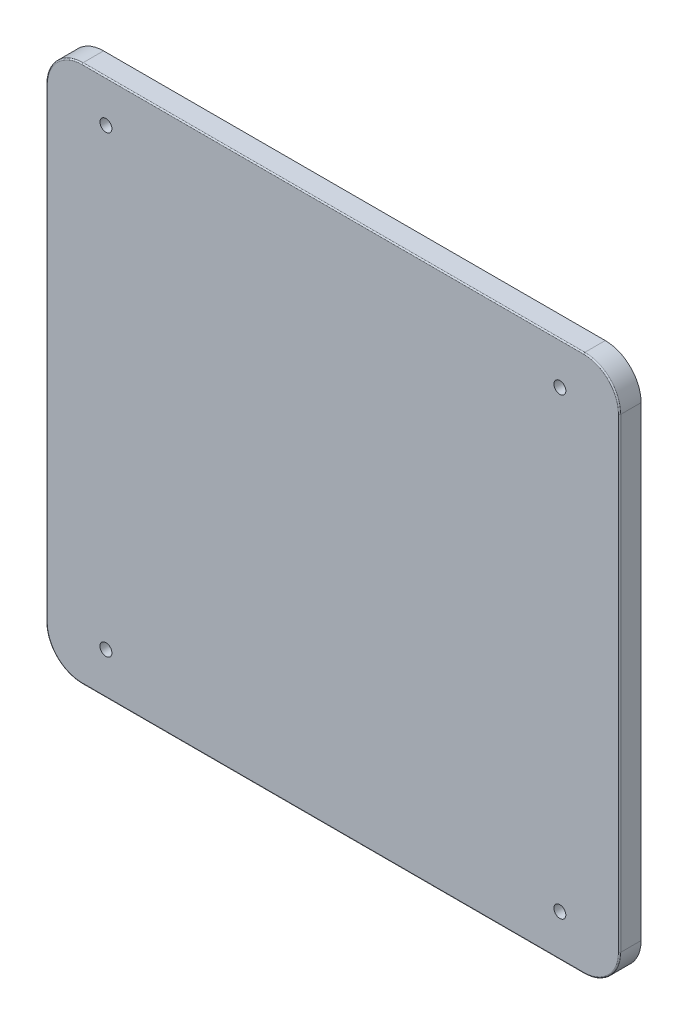
ISO-10303-21;
HEADER;
FILE_DESCRIPTION(('STEP AP214'),'2;1');
FILE_NAME('part.step','',(''),(''),'','','');
FILE_SCHEMA(('AUTOMOTIVE_DESIGN { 1 0 10303 214 1 1 1 1 }'));
ENDSEC;
DATA;
#1=APPLICATION_CONTEXT('core data for automotive mechanical design processes');
#2=APPLICATION_PROTOCOL_DEFINITION('international standard','automotive_design',2000,#1);
#3=PRODUCT_CONTEXT('',#1,'mechanical');
#4=PRODUCT('Part','Part','',(#3));
#5=PRODUCT_RELATED_PRODUCT_CATEGORY('part','',(#4));
#6=PRODUCT_DEFINITION_FORMATION('','',#4);
#7=PRODUCT_DEFINITION_CONTEXT('part definition',#1,'design');
#8=PRODUCT_DEFINITION('design','',#6,#7);
#9=PRODUCT_DEFINITION_SHAPE('','',#8);
#10=(LENGTH_UNIT() NAMED_UNIT(*) SI_UNIT(.MILLI.,.METRE.));
#11=(NAMED_UNIT(*) PLANE_ANGLE_UNIT() SI_UNIT($,.RADIAN.));
#12=(NAMED_UNIT(*) SI_UNIT($,.STERADIAN.) SOLID_ANGLE_UNIT());
#13=UNCERTAINTY_MEASURE_WITH_UNIT(LENGTH_MEASURE(1.E-05),#10,'distance_accuracy_value','');
#14=(GEOMETRIC_REPRESENTATION_CONTEXT(3) GLOBAL_UNCERTAINTY_ASSIGNED_CONTEXT((#13)) GLOBAL_UNIT_ASSIGNED_CONTEXT((#10,
#11,#12)) REPRESENTATION_CONTEXT('',''));
#15=CARTESIAN_POINT('',(0.,0.,0.));
#16=DIRECTION('',(0.,0.,1.));
#17=DIRECTION('',(1.,0.,0.));
#18=AXIS2_PLACEMENT_3D('',#15,#16,#17);
#19=CARTESIAN_POINT('',(-240.,-225.,18.));
#20=DIRECTION('',(0.,1.,0.));
#21=DIRECTION('',(0.,0.,1.));
#22=AXIS2_PLACEMENT_3D('',#19,#20,#21);
#23=PLANE('',#22);
#24=DIRECTION('',(0.,0.,-1.));
#25=VECTOR('',#24,1.);
#26=CARTESIAN_POINT('',(210.,-225.,18.));
#27=LINE('',#26,#25);
#28=CARTESIAN_POINT('',(210.,-225.,17.));
#29=VERTEX_POINT('',#28);
#30=CARTESIAN_POINT('',(210.,-225.,0.));
#31=VERTEX_POINT('',#30);
#32=EDGE_CURVE('E205',#29,#31,#27,.T.);
#33=ORIENTED_EDGE('',*,*,#32,.F.);
#34=DIRECTION('',(1.,0.,0.));
#35=VECTOR('',#34,1.);
#36=CARTESIAN_POINT('',(-210.,-225.,17.));
#37=LINE('',#36,#35);
#38=CARTESIAN_POINT('',(-210.,-225.,17.));
#39=VERTEX_POINT('',#38);
#40=EDGE_CURVE('E234',#29,#39,#37,.F.);
#41=ORIENTED_EDGE('',*,*,#40,.T.);
#42=DIRECTION('',(0.,0.,-1.));
#43=VECTOR('',#42,1.);
#44=CARTESIAN_POINT('',(-210.,-225.,18.));
#45=LINE('',#44,#43);
#46=CARTESIAN_POINT('',(-210.,-225.,0.));
#47=VERTEX_POINT('',#46);
#48=EDGE_CURVE('E207',#39,#47,#45,.T.);
#49=ORIENTED_EDGE('',*,*,#48,.T.);
#50=DIRECTION('',(1.,0.,0.));
#51=VECTOR('',#50,1.);
#52=CARTESIAN_POINT('',(-240.,-225.,0.));
#53=LINE('',#52,#51);
#54=EDGE_CURVE('E174',#47,#31,#53,.T.);
#55=ORIENTED_EDGE('',*,*,#54,.T.);
#56=EDGE_LOOP('',(#33,#41,#49,#55));
#57=FACE_BOUND('',#56,.T.);
#58=ADVANCED_FACE('F41',(#57),#23,.F.);
#59=CARTESIAN_POINT('',(210.,-195.,18.));
#60=DIRECTION('',(0.,0.,-1.));
#61=DIRECTION('',(-1.,0.,0.));
#62=AXIS2_PLACEMENT_3D('',#59,#60,#61);
#63=CYLINDRICAL_SURFACE('',#62,30.);
#64=DIRECTION('',(0.,0.,-1.));
#65=VECTOR('',#64,1.);
#66=CARTESIAN_POINT('',(240.,-195.,18.));
#67=LINE('',#66,#65);
#68=CARTESIAN_POINT('',(240.,-195.,17.));
#69=VERTEX_POINT('',#68);
#70=CARTESIAN_POINT('',(240.,-195.,0.));
#71=VERTEX_POINT('',#70);
#72=EDGE_CURVE('E203',#69,#71,#67,.T.);
#73=ORIENTED_EDGE('',*,*,#72,.F.);
#74=CARTESIAN_POINT('',(210.,-195.,17.));
#75=DIRECTION('',(0.,0.,1.));
#76=DIRECTION('',(1.,0.,0.));
#77=AXIS2_PLACEMENT_3D('',#74,#75,#76);
#78=CIRCLE('',#77,30.);
#79=EDGE_CURVE('E231',#69,#29,#78,.F.);
#80=ORIENTED_EDGE('',*,*,#79,.T.);
#81=ORIENTED_EDGE('',*,*,#32,.T.);
#82=CARTESIAN_POINT('',(210.,-195.,0.));
#83=DIRECTION('',(0.,0.,1.));
#84=DIRECTION('',(1.,0.,0.));
#85=AXIS2_PLACEMENT_3D('',#82,#83,#84);
#86=CIRCLE('',#85,30.);
#87=EDGE_CURVE('E177',#31,#71,#86,.T.);
#88=ORIENTED_EDGE('',*,*,#87,.T.);
#89=EDGE_LOOP('',(#73,#80,#81,#88));
#90=FACE_BOUND('',#89,.T.);
#91=ADVANCED_FACE('F322',(#90),#63,.T.);
#92=CARTESIAN_POINT('',(240.,195.,18.));
#93=DIRECTION('',(-1.,0.,0.));
#94=DIRECTION('',(0.,-1.,0.));
#95=AXIS2_PLACEMENT_3D('',#92,#93,#94);
#96=PLANE('',#95);
#97=DIRECTION('',(0.,0.,-1.));
#98=VECTOR('',#97,1.);
#99=CARTESIAN_POINT('',(240.,195.,18.));
#100=LINE('',#99,#98);
#101=CARTESIAN_POINT('',(240.,195.,17.));
#102=VERTEX_POINT('',#101);
#103=CARTESIAN_POINT('',(240.,195.,0.));
#104=VERTEX_POINT('',#103);
#105=EDGE_CURVE('E201',#102,#104,#100,.T.);
#106=ORIENTED_EDGE('',*,*,#105,.F.);
#107=DIRECTION('',(0.,1.,0.));
#108=VECTOR('',#107,1.);
#109=CARTESIAN_POINT('',(240.,-195.,17.));
#110=LINE('',#109,#108);
#111=EDGE_CURVE('E11',#102,#69,#110,.F.);
#112=ORIENTED_EDGE('',*,*,#111,.T.);
#113=ORIENTED_EDGE('',*,*,#72,.T.);
#114=DIRECTION('',(0.,1.,0.));
#115=VECTOR('',#114,1.);
#116=CARTESIAN_POINT('',(240.,195.,0.));
#117=LINE('',#116,#115);
#118=EDGE_CURVE('E180',#71,#104,#117,.T.);
#119=ORIENTED_EDGE('',*,*,#118,.T.);
#120=EDGE_LOOP('',(#106,#112,#113,#119));
#121=FACE_BOUND('',#120,.T.);
#122=ADVANCED_FACE('F319',(#121),#96,.F.);
#123=CARTESIAN_POINT('',(210.,195.,18.));
#124=DIRECTION('',(0.,0.,-1.));
#125=DIRECTION('',(-1.,0.,0.));
#126=AXIS2_PLACEMENT_3D('',#123,#124,#125);
#127=CYLINDRICAL_SURFACE('',#126,30.);
#128=DIRECTION('',(0.,0.,-1.));
#129=VECTOR('',#128,1.);
#130=CARTESIAN_POINT('',(210.,225.,18.));
#131=LINE('',#130,#129);
#132=CARTESIAN_POINT('',(210.,225.,17.));
#133=VERTEX_POINT('',#132);
#134=CARTESIAN_POINT('',(210.,225.,0.));
#135=VERTEX_POINT('',#134);
#136=EDGE_CURVE('E199',#133,#135,#131,.T.);
#137=ORIENTED_EDGE('',*,*,#136,.F.);
#138=CARTESIAN_POINT('',(210.,195.,17.));
#139=DIRECTION('',(0.,0.,1.));
#140=DIRECTION('',(1.,0.,0.));
#141=AXIS2_PLACEMENT_3D('',#138,#139,#140);
#142=CIRCLE('',#141,30.);
#143=EDGE_CURVE('E50',#133,#102,#142,.F.);
#144=ORIENTED_EDGE('',*,*,#143,.T.);
#145=ORIENTED_EDGE('',*,*,#105,.T.);
#146=CARTESIAN_POINT('',(210.,195.,0.));
#147=DIRECTION('',(0.,0.,1.));
#148=DIRECTION('',(-1.,0.,0.));
#149=AXIS2_PLACEMENT_3D('',#146,#147,#148);
#150=CIRCLE('',#149,30.);
#151=EDGE_CURVE('E183',#104,#135,#150,.T.);
#152=ORIENTED_EDGE('',*,*,#151,.T.);
#153=EDGE_LOOP('',(#137,#144,#145,#152));
#154=FACE_BOUND('',#153,.T.);
#155=ADVANCED_FACE('F386',(#154),#127,.T.);
#156=CARTESIAN_POINT('',(-210.,225.,18.));
#157=DIRECTION('',(0.,-1.,0.));
#158=DIRECTION('',(0.,0.,-1.));
#159=AXIS2_PLACEMENT_3D('',#156,#157,#158);
#160=PLANE('',#159);
#161=DIRECTION('',(0.,0.,-1.));
#162=VECTOR('',#161,1.);
#163=CARTESIAN_POINT('',(-210.,225.,18.));
#164=LINE('',#163,#162);
#165=CARTESIAN_POINT('',(-210.,225.,17.));
#166=VERTEX_POINT('',#165);
#167=CARTESIAN_POINT('',(-210.,225.,0.));
#168=VERTEX_POINT('',#167);
#169=EDGE_CURVE('E197',#166,#168,#164,.T.);
#170=ORIENTED_EDGE('',*,*,#169,.F.);
#171=DIRECTION('',(-1.,0.,0.));
#172=VECTOR('',#171,1.);
#173=CARTESIAN_POINT('',(210.,225.,17.));
#174=LINE('',#173,#172);
#175=EDGE_CURVE('E65',#166,#133,#174,.F.);
#176=ORIENTED_EDGE('',*,*,#175,.T.);
#177=ORIENTED_EDGE('',*,*,#136,.T.);
#178=DIRECTION('',(-1.,0.,0.));
#179=VECTOR('',#178,1.);
#180=CARTESIAN_POINT('',(-210.,225.,0.));
#181=LINE('',#180,#179);
#182=EDGE_CURVE('E186',#135,#168,#181,.T.);
#183=ORIENTED_EDGE('',*,*,#182,.T.);
#184=EDGE_LOOP('',(#170,#176,#177,#183));
#185=FACE_BOUND('',#184,.T.);
#186=ADVANCED_FACE('F277',(#185),#160,.F.);
#187=CARTESIAN_POINT('',(-210.,195.,18.));
#188=DIRECTION('',(0.,0.,-1.));
#189=DIRECTION('',(-1.,0.,0.));
#190=AXIS2_PLACEMENT_3D('',#187,#188,#189);
#191=CYLINDRICAL_SURFACE('',#190,30.);
#192=DIRECTION('',(0.,0.,-1.));
#193=VECTOR('',#192,1.);
#194=CARTESIAN_POINT('',(-240.,195.,18.));
#195=LINE('',#194,#193);
#196=CARTESIAN_POINT('',(-240.,195.,17.));
#197=VERTEX_POINT('',#196);
#198=CARTESIAN_POINT('',(-240.,195.,0.));
#199=VERTEX_POINT('',#198);
#200=EDGE_CURVE('E195',#197,#199,#195,.T.);
#201=ORIENTED_EDGE('',*,*,#200,.F.);
#202=CARTESIAN_POINT('',(-210.,195.,17.));
#203=DIRECTION('',(0.,0.,1.));
#204=DIRECTION('',(1.,0.,0.));
#205=AXIS2_PLACEMENT_3D('',#202,#203,#204);
#206=CIRCLE('',#205,30.);
#207=EDGE_CURVE('E240',#197,#166,#206,.F.);
#208=ORIENTED_EDGE('',*,*,#207,.T.);
#209=ORIENTED_EDGE('',*,*,#169,.T.);
#210=CARTESIAN_POINT('',(-210.,195.,0.));
#211=DIRECTION('',(0.,0.,1.));
#212=DIRECTION('',(1.,0.,0.));
#213=AXIS2_PLACEMENT_3D('',#210,#211,#212);
#214=CIRCLE('',#213,30.);
#215=EDGE_CURVE('E189',#168,#199,#214,.T.);
#216=ORIENTED_EDGE('',*,*,#215,.T.);
#217=EDGE_LOOP('',(#201,#208,#209,#216));
#218=FACE_BOUND('',#217,.T.);
#219=ADVANCED_FACE('F276',(#218),#191,.T.);
#220=CARTESIAN_POINT('',(-240.,195.,18.));
#221=DIRECTION('',(1.,0.,0.));
#222=DIRECTION('',(0.,1.,0.));
#223=AXIS2_PLACEMENT_3D('',#220,#221,#222);
#224=PLANE('',#223);
#225=DIRECTION('',(0.,0.,-1.));
#226=VECTOR('',#225,1.);
#227=CARTESIAN_POINT('',(-240.,-195.,18.));
#228=LINE('',#227,#226);
#229=CARTESIAN_POINT('',(-240.,-195.,0.));
#230=VERTEX_POINT('',#229);
#231=CARTESIAN_POINT('',(-240.,-195.,17.));
#232=VERTEX_POINT('',#231);
#233=EDGE_CURVE('E211',#230,#232,#228,.F.);
#234=ORIENTED_EDGE('',*,*,#233,.T.);
#235=DIRECTION('',(0.,-1.,0.));
#236=VECTOR('',#235,1.);
#237=CARTESIAN_POINT('',(-240.,195.,17.));
#238=LINE('',#237,#236);
#239=EDGE_CURVE('E238',#232,#197,#238,.F.);
#240=ORIENTED_EDGE('',*,*,#239,.T.);
#241=ORIENTED_EDGE('',*,*,#200,.T.);
#242=DIRECTION('',(0.,-1.,0.));
#243=VECTOR('',#242,1.);
#244=CARTESIAN_POINT('',(-240.,195.,0.));
#245=LINE('',#244,#243);
#246=EDGE_CURVE('E192',#199,#230,#245,.T.);
#247=ORIENTED_EDGE('',*,*,#246,.T.);
#248=EDGE_LOOP('',(#234,#240,#241,#247));
#249=FACE_BOUND('',#248,.T.);
#250=ADVANCED_FACE('F288',(#249),#224,.F.);
#251=CARTESIAN_POINT('',(210.,-195.,18.));
#252=DIRECTION('',(0.,0.,1.));
#253=DIRECTION('',(1.,0.,0.));
#254=AXIS2_PLACEMENT_3D('',#251,#252,#253);
#255=PLANE('',#254);
#256=DIRECTION('',(1.,0.,0.));
#257=VECTOR('',#256,1.);
#258=CARTESIAN_POINT('',(210.,-224.,18.));
#259=LINE('',#258,#257);
#260=CARTESIAN_POINT('',(-210.,-224.,18.));
#261=VERTEX_POINT('',#260);
#262=CARTESIAN_POINT('',(210.,-224.,18.));
#263=VERTEX_POINT('',#262);
#264=EDGE_CURVE('E226',#261,#263,#259,.T.);
#265=ORIENTED_EDGE('',*,*,#264,.T.);
#266=CARTESIAN_POINT('',(210.,-195.,18.));
#267=DIRECTION('',(0.,0.,1.));
#268=DIRECTION('',(1.,0.,0.));
#269=AXIS2_PLACEMENT_3D('',#266,#267,#268);
#270=CIRCLE('',#269,29.);
#271=CARTESIAN_POINT('',(239.,-195.,18.));
#272=VERTEX_POINT('',#271);
#273=EDGE_CURVE('E228',#263,#272,#270,.T.);
#274=ORIENTED_EDGE('',*,*,#273,.T.);
#275=DIRECTION('',(0.,1.,0.));
#276=VECTOR('',#275,1.);
#277=CARTESIAN_POINT('',(239.,195.,18.));
#278=LINE('',#277,#276);
#279=CARTESIAN_POINT('',(239.,195.,18.));
#280=VERTEX_POINT('',#279);
#281=EDGE_CURVE('E214',#272,#280,#278,.T.);
#282=ORIENTED_EDGE('',*,*,#281,.T.);
#283=CARTESIAN_POINT('',(210.,195.,18.));
#284=DIRECTION('',(0.,0.,1.));
#285=DIRECTION('',(1.,0.,0.));
#286=AXIS2_PLACEMENT_3D('',#283,#284,#285);
#287=CIRCLE('',#286,29.);
#288=CARTESIAN_POINT('',(210.,224.,18.));
#289=VERTEX_POINT('',#288);
#290=EDGE_CURVE('E216',#280,#289,#287,.T.);
#291=ORIENTED_EDGE('',*,*,#290,.T.);
#292=DIRECTION('',(-1.,0.,0.));
#293=VECTOR('',#292,1.);
#294=CARTESIAN_POINT('',(-210.,224.,18.));
#295=LINE('',#294,#293);
#296=CARTESIAN_POINT('',(-210.,224.,18.));
#297=VERTEX_POINT('',#296);
#298=EDGE_CURVE('E218',#289,#297,#295,.T.);
#299=ORIENTED_EDGE('',*,*,#298,.T.);
#300=CARTESIAN_POINT('',(-210.,195.,18.));
#301=DIRECTION('',(0.,0.,1.));
#302=DIRECTION('',(1.,0.,0.));
#303=AXIS2_PLACEMENT_3D('',#300,#301,#302);
#304=CIRCLE('',#303,29.);
#305=CARTESIAN_POINT('',(-239.,195.,18.));
#306=VERTEX_POINT('',#305);
#307=EDGE_CURVE('E220',#297,#306,#304,.T.);
#308=ORIENTED_EDGE('',*,*,#307,.T.);
#309=DIRECTION('',(0.,-1.,0.));
#310=VECTOR('',#309,1.);
#311=CARTESIAN_POINT('',(-239.,-195.,18.));
#312=LINE('',#311,#310);
#313=CARTESIAN_POINT('',(-239.,-195.,18.));
#314=VERTEX_POINT('',#313);
#315=EDGE_CURVE('E222',#306,#314,#312,.T.);
#316=ORIENTED_EDGE('',*,*,#315,.T.);
#317=CARTESIAN_POINT('',(-210.,-195.,18.));
#318=DIRECTION('',(0.,0.,1.));
#319=DIRECTION('',(1.,0.,0.));
#320=AXIS2_PLACEMENT_3D('',#317,#318,#319);
#321=CIRCLE('',#320,29.);
#322=EDGE_CURVE('E224',#314,#261,#321,.T.);
#323=ORIENTED_EDGE('',*,*,#322,.T.);
#324=EDGE_LOOP('',(#265,#274,#282,#291,#299,#308,#316,#323));
#325=FACE_BOUND('',#324,.T.);
#326=CARTESIAN_POINT('',(-190.,190.,18.));
#327=DIRECTION('',(0.,0.,1.));
#328=DIRECTION('',(1.,0.,0.));
#329=AXIS2_PLACEMENT_3D('',#326,#327,#328);
#330=CIRCLE('',#329,5.);
#331=CARTESIAN_POINT('',(-185.,190.,18.));
#332=VERTEX_POINT('',#331);
#333=EDGE_CURVE('E152',#332,#332,#330,.T.);
#334=ORIENTED_EDGE('',*,*,#333,.F.);
#335=EDGE_LOOP('',(#334));
#336=FACE_BOUND('',#335,.T.);
#337=CARTESIAN_POINT('',(190.,190.,18.));
#338=DIRECTION('',(0.,0.,1.));
#339=DIRECTION('',(1.,0.,0.));
#340=AXIS2_PLACEMENT_3D('',#337,#338,#339);
#341=CIRCLE('',#340,5.);
#342=CARTESIAN_POINT('',(195.,190.,18.));
#343=VERTEX_POINT('',#342);
#344=EDGE_CURVE('E151',#343,#343,#341,.T.);
#345=ORIENTED_EDGE('',*,*,#344,.F.);
#346=EDGE_LOOP('',(#345));
#347=FACE_BOUND('',#346,.T.);
#348=CARTESIAN_POINT('',(190.,-190.,18.));
#349=DIRECTION('',(0.,0.,1.));
#350=DIRECTION('',(1.,0.,0.));
#351=AXIS2_PLACEMENT_3D('',#348,#349,#350);
#352=CIRCLE('',#351,5.);
#353=CARTESIAN_POINT('',(195.,-190.,18.));
#354=VERTEX_POINT('',#353);
#355=EDGE_CURVE('E162',#354,#354,#352,.T.);
#356=ORIENTED_EDGE('',*,*,#355,.F.);
#357=EDGE_LOOP('',(#356));
#358=FACE_BOUND('',#357,.T.);
#359=CARTESIAN_POINT('',(-190.,-190.,18.));
#360=DIRECTION('',(0.,0.,1.));
#361=DIRECTION('',(1.,0.,0.));
#362=AXIS2_PLACEMENT_3D('',#359,#360,#361);
#363=CIRCLE('',#362,5.);
#364=CARTESIAN_POINT('',(-185.,-190.,18.));
#365=VERTEX_POINT('',#364);
#366=EDGE_CURVE('E168',#365,#365,#363,.T.);
#367=ORIENTED_EDGE('',*,*,#366,.F.);
#368=EDGE_LOOP('',(#367));
#369=FACE_BOUND('',#368,.T.);
#370=ADVANCED_FACE('F304',(#325,#336,#347,#358,#369),#255,.T.);
#371=CARTESIAN_POINT('',(210.,-195.,0.));
#372=DIRECTION('',(0.,0.,1.));
#373=DIRECTION('',(1.,0.,0.));
#374=AXIS2_PLACEMENT_3D('',#371,#372,#373);
#375=PLANE('',#374);
#376=ORIENTED_EDGE('',*,*,#54,.F.);
#377=CARTESIAN_POINT('',(-210.,-195.,0.));
#378=DIRECTION('',(0.,0.,1.));
#379=DIRECTION('',(1.,0.,0.));
#380=AXIS2_PLACEMENT_3D('',#377,#378,#379);
#381=CIRCLE('',#380,30.);
#382=EDGE_CURVE('E209',#47,#230,#381,.F.);
#383=ORIENTED_EDGE('',*,*,#382,.T.);
#384=ORIENTED_EDGE('',*,*,#246,.F.);
#385=ORIENTED_EDGE('',*,*,#215,.F.);
#386=ORIENTED_EDGE('',*,*,#182,.F.);
#387=ORIENTED_EDGE('',*,*,#151,.F.);
#388=ORIENTED_EDGE('',*,*,#118,.F.);
#389=ORIENTED_EDGE('',*,*,#87,.F.);
#390=EDGE_LOOP('',(#376,#383,#384,#385,#386,#387,#388,#389));
#391=FACE_BOUND('',#390,.T.);
#392=ADVANCED_FACE('F284',(#391),#375,.F.);
#393=CARTESIAN_POINT('',(-190.,-190.,8.));
#394=DIRECTION('',(0.,0.,1.));
#395=DIRECTION('',(1.,0.,0.));
#396=AXIS2_PLACEMENT_3D('',#393,#394,#395);
#397=CONICAL_SURFACE('',#396,5.,1.02974425867665);
#398=CARTESIAN_POINT('',(-190.,-190.,4.99569690486219));
#399=VERTEX_POINT('',#398);
#400=VERTEX_LOOP('',#399);
#401=FACE_BOUND('',#400,.T.);
#402=CARTESIAN_POINT('',(-190.,-190.,8.));
#403=DIRECTION('',(0.,0.,1.));
#404=DIRECTION('',(1.,0.,0.));
#405=AXIS2_PLACEMENT_3D('',#402,#403,#404);
#406=CIRCLE('',#405,5.);
#407=CARTESIAN_POINT('',(-185.,-190.,8.));
#408=VERTEX_POINT('',#407);
#409=EDGE_CURVE('E171',#408,#408,#406,.T.);
#410=ORIENTED_EDGE('',*,*,#409,.T.);
#411=EDGE_LOOP('',(#410));
#412=FACE_BOUND('',#411,.T.);
#413=ADVANCED_FACE('F373',(#401,#412),#397,.F.);
#414=CARTESIAN_POINT('',(-190.,-190.,18.));
#415=DIRECTION('',(0.,0.,1.));
#416=DIRECTION('',(1.,0.,0.));
#417=AXIS2_PLACEMENT_3D('',#414,#415,#416);
#418=CYLINDRICAL_SURFACE('',#417,5.);
#419=ORIENTED_EDGE('',*,*,#409,.F.);
#420=EDGE_LOOP('',(#419));
#421=FACE_BOUND('',#420,.T.);
#422=ORIENTED_EDGE('',*,*,#366,.T.);
#423=EDGE_LOOP('',(#422));
#424=FACE_BOUND('',#423,.T.);
#425=ADVANCED_FACE('F369',(#421,#424),#418,.F.);
#426=CARTESIAN_POINT('',(190.,-190.,8.));
#427=DIRECTION('',(0.,0.,1.));
#428=DIRECTION('',(1.,0.,0.));
#429=AXIS2_PLACEMENT_3D('',#426,#427,#428);
#430=CONICAL_SURFACE('',#429,5.,1.02974425867665);
#431=CARTESIAN_POINT('',(190.,-190.,4.99569690486219));
#432=VERTEX_POINT('',#431);
#433=VERTEX_LOOP('',#432);
#434=FACE_BOUND('',#433,.T.);
#435=CARTESIAN_POINT('',(190.,-190.,8.));
#436=DIRECTION('',(0.,0.,1.));
#437=DIRECTION('',(1.,0.,0.));
#438=AXIS2_PLACEMENT_3D('',#435,#436,#437);
#439=CIRCLE('',#438,5.);
#440=CARTESIAN_POINT('',(195.,-190.,8.));
#441=VERTEX_POINT('',#440);
#442=EDGE_CURVE('E165',#441,#441,#439,.T.);
#443=ORIENTED_EDGE('',*,*,#442,.T.);
#444=EDGE_LOOP('',(#443));
#445=FACE_BOUND('',#444,.T.);
#446=ADVANCED_FACE('F365',(#434,#445),#430,.F.);
#447=CARTESIAN_POINT('',(190.,-190.,18.));
#448=DIRECTION('',(0.,0.,1.));
#449=DIRECTION('',(1.,0.,0.));
#450=AXIS2_PLACEMENT_3D('',#447,#448,#449);
#451=CYLINDRICAL_SURFACE('',#450,5.);
#452=ORIENTED_EDGE('',*,*,#442,.F.);
#453=EDGE_LOOP('',(#452));
#454=FACE_BOUND('',#453,.T.);
#455=ORIENTED_EDGE('',*,*,#355,.T.);
#456=EDGE_LOOP('',(#455));
#457=FACE_BOUND('',#456,.T.);
#458=ADVANCED_FACE('F361',(#454,#457),#451,.F.);
#459=CARTESIAN_POINT('',(190.,190.,8.));
#460=DIRECTION('',(0.,0.,1.));
#461=DIRECTION('',(1.,0.,0.));
#462=AXIS2_PLACEMENT_3D('',#459,#460,#461);
#463=CONICAL_SURFACE('',#462,5.,1.02974425867665);
#464=CARTESIAN_POINT('',(190.,190.,4.99569690486219));
#465=VERTEX_POINT('',#464);
#466=VERTEX_LOOP('',#465);
#467=FACE_BOUND('',#466,.T.);
#468=CARTESIAN_POINT('',(190.,190.,8.));
#469=DIRECTION('',(0.,0.,1.));
#470=DIRECTION('',(1.,0.,0.));
#471=AXIS2_PLACEMENT_3D('',#468,#469,#470);
#472=CIRCLE('',#471,5.);
#473=CARTESIAN_POINT('',(195.,190.,8.));
#474=VERTEX_POINT('',#473);
#475=EDGE_CURVE('E155',#474,#474,#472,.T.);
#476=ORIENTED_EDGE('',*,*,#475,.T.);
#477=EDGE_LOOP('',(#476));
#478=FACE_BOUND('',#477,.T.);
#479=ADVANCED_FACE('F357',(#467,#478),#463,.F.);
#480=CARTESIAN_POINT('',(190.,190.,18.));
#481=DIRECTION('',(0.,0.,1.));
#482=DIRECTION('',(1.,0.,0.));
#483=AXIS2_PLACEMENT_3D('',#480,#481,#482);
#484=CYLINDRICAL_SURFACE('',#483,5.);
#485=ORIENTED_EDGE('',*,*,#475,.F.);
#486=EDGE_LOOP('',(#485));
#487=FACE_BOUND('',#486,.T.);
#488=ORIENTED_EDGE('',*,*,#344,.T.);
#489=EDGE_LOOP('',(#488));
#490=FACE_BOUND('',#489,.T.);
#491=ADVANCED_FACE('F145',(#487,#490),#484,.F.);
#492=CARTESIAN_POINT('',(-190.,190.,8.));
#493=DIRECTION('',(0.,0.,1.));
#494=DIRECTION('',(1.,0.,0.));
#495=AXIS2_PLACEMENT_3D('',#492,#493,#494);
#496=CONICAL_SURFACE('',#495,5.,1.02974425867665);
#497=CARTESIAN_POINT('',(-190.,190.,4.99569690486219));
#498=VERTEX_POINT('',#497);
#499=VERTEX_LOOP('',#498);
#500=FACE_BOUND('',#499,.T.);
#501=CARTESIAN_POINT('',(-190.,190.,8.));
#502=DIRECTION('',(0.,0.,1.));
#503=DIRECTION('',(1.,0.,0.));
#504=AXIS2_PLACEMENT_3D('',#501,#502,#503);
#505=CIRCLE('',#504,5.);
#506=CARTESIAN_POINT('',(-185.,190.,8.));
#507=VERTEX_POINT('',#506);
#508=EDGE_CURVE('E149',#507,#507,#505,.T.);
#509=ORIENTED_EDGE('',*,*,#508,.T.);
#510=EDGE_LOOP('',(#509));
#511=FACE_BOUND('',#510,.T.);
#512=ADVANCED_FACE('F141',(#500,#511),#496,.F.);
#513=CARTESIAN_POINT('',(-190.,190.,18.));
#514=DIRECTION('',(0.,0.,1.));
#515=DIRECTION('',(1.,0.,0.));
#516=AXIS2_PLACEMENT_3D('',#513,#514,#515);
#517=CYLINDRICAL_SURFACE('',#516,5.);
#518=ORIENTED_EDGE('',*,*,#508,.F.);
#519=EDGE_LOOP('',(#518));
#520=FACE_BOUND('',#519,.T.);
#521=ORIENTED_EDGE('',*,*,#333,.T.);
#522=EDGE_LOOP('',(#521));
#523=FACE_BOUND('',#522,.T.);
#524=ADVANCED_FACE('F144',(#520,#523),#517,.F.);
#525=CARTESIAN_POINT('',(-210.,-195.,18.));
#526=DIRECTION('',(0.,0.,-1.));
#527=DIRECTION('',(-1.,0.,0.));
#528=AXIS2_PLACEMENT_3D('',#525,#526,#527);
#529=CYLINDRICAL_SURFACE('',#528,30.);
#530=ORIENTED_EDGE('',*,*,#48,.F.);
#531=CARTESIAN_POINT('',(-210.,-195.,17.));
#532=DIRECTION('',(0.,0.,1.));
#533=DIRECTION('',(1.,0.,0.));
#534=AXIS2_PLACEMENT_3D('',#531,#532,#533);
#535=CIRCLE('',#534,30.);
#536=EDGE_CURVE('E236',#39,#232,#535,.F.);
#537=ORIENTED_EDGE('',*,*,#536,.T.);
#538=ORIENTED_EDGE('',*,*,#233,.F.);
#539=ORIENTED_EDGE('',*,*,#382,.F.);
#540=EDGE_LOOP('',(#530,#537,#538,#539));
#541=FACE_BOUND('',#540,.T.);
#542=ADVANCED_FACE('F291',(#541),#529,.T.);
#543=CARTESIAN_POINT('',(-210.,195.,17.));
#544=DIRECTION('',(0.,0.,1.));
#545=DIRECTION('',(1.,0.,0.));
#546=AXIS2_PLACEMENT_3D('',#543,#544,#545);
#547=TOROIDAL_SURFACE('',#546,29.,1.);
#548=CARTESIAN_POINT('',(-210.,224.,17.));
#549=DIRECTION('',(1.,0.,0.));
#550=DIRECTION('',(0.,0.,-1.));
#551=AXIS2_PLACEMENT_3D('',#548,#549,#550);
#552=CIRCLE('',#551,1.);
#553=EDGE_CURVE('E259',#166,#297,#552,.T.);
#554=ORIENTED_EDGE('',*,*,#553,.F.);
#555=ORIENTED_EDGE('',*,*,#207,.F.);
#556=CARTESIAN_POINT('',(-239.,195.,17.));
#557=DIRECTION('',(0.,-1.,0.));
#558=DIRECTION('',(0.,0.,-1.));
#559=AXIS2_PLACEMENT_3D('',#556,#557,#558);
#560=CIRCLE('',#559,1.);
#561=EDGE_CURVE('E45',#306,#197,#560,.T.);
#562=ORIENTED_EDGE('',*,*,#561,.F.);
#563=ORIENTED_EDGE('',*,*,#307,.F.);
#564=EDGE_LOOP('',(#554,#555,#562,#563));
#565=FACE_BOUND('',#564,.T.);
#566=ADVANCED_FACE('F43',(#565),#547,.T.);
#567=CARTESIAN_POINT('',(-239.,-195.,17.));
#568=DIRECTION('',(0.,1.,0.));
#569=DIRECTION('',(-1.,0.,0.));
#570=AXIS2_PLACEMENT_3D('',#567,#568,#569);
#571=CYLINDRICAL_SURFACE('',#570,1.);
#572=ORIENTED_EDGE('',*,*,#561,.T.);
#573=ORIENTED_EDGE('',*,*,#239,.F.);
#574=CARTESIAN_POINT('',(-239.,-195.,17.));
#575=DIRECTION('',(0.,-1.,0.));
#576=DIRECTION('',(0.,0.,-1.));
#577=AXIS2_PLACEMENT_3D('',#574,#575,#576);
#578=CIRCLE('',#577,1.);
#579=EDGE_CURVE('E257',#314,#232,#578,.T.);
#580=ORIENTED_EDGE('',*,*,#579,.F.);
#581=ORIENTED_EDGE('',*,*,#315,.F.);
#582=EDGE_LOOP('',(#572,#573,#580,#581));
#583=FACE_BOUND('',#582,.T.);
#584=ADVANCED_FACE('F269',(#583),#571,.T.);
#585=CARTESIAN_POINT('',(210.,224.,17.));
#586=DIRECTION('',(1.,0.,0.));
#587=DIRECTION('',(0.,0.,-1.));
#588=AXIS2_PLACEMENT_3D('',#585,#586,#587);
#589=CYLINDRICAL_SURFACE('',#588,1.);
#590=ORIENTED_EDGE('',*,*,#553,.T.);
#591=ORIENTED_EDGE('',*,*,#298,.F.);
#592=CARTESIAN_POINT('',(210.,224.,17.));
#593=DIRECTION('',(1.,0.,0.));
#594=DIRECTION('',(0.,0.,-1.));
#595=AXIS2_PLACEMENT_3D('',#592,#593,#594);
#596=CIRCLE('',#595,1.);
#597=EDGE_CURVE('E254',#133,#289,#596,.T.);
#598=ORIENTED_EDGE('',*,*,#597,.F.);
#599=ORIENTED_EDGE('',*,*,#175,.F.);
#600=EDGE_LOOP('',(#590,#591,#598,#599));
#601=FACE_BOUND('',#600,.T.);
#602=ADVANCED_FACE('F308',(#601),#589,.T.);
#603=CARTESIAN_POINT('',(-210.,-195.,17.));
#604=DIRECTION('',(0.,0.,1.));
#605=DIRECTION('',(1.,0.,0.));
#606=AXIS2_PLACEMENT_3D('',#603,#604,#605);
#607=TOROIDAL_SURFACE('',#606,29.,1.);
#608=ORIENTED_EDGE('',*,*,#579,.T.);
#609=ORIENTED_EDGE('',*,*,#536,.F.);
#610=CARTESIAN_POINT('',(-210.,-224.,17.));
#611=DIRECTION('',(1.,0.,0.));
#612=DIRECTION('',(0.,0.,-1.));
#613=AXIS2_PLACEMENT_3D('',#610,#611,#612);
#614=CIRCLE('',#613,1.);
#615=EDGE_CURVE('E251',#261,#39,#614,.T.);
#616=ORIENTED_EDGE('',*,*,#615,.F.);
#617=ORIENTED_EDGE('',*,*,#322,.F.);
#618=EDGE_LOOP('',(#608,#609,#616,#617));
#619=FACE_BOUND('',#618,.T.);
#620=ADVANCED_FACE('F295',(#619),#607,.T.);
#621=CARTESIAN_POINT('',(210.,195.,17.));
#622=DIRECTION('',(0.,0.,1.));
#623=DIRECTION('',(1.,0.,0.));
#624=AXIS2_PLACEMENT_3D('',#621,#622,#623);
#625=TOROIDAL_SURFACE('',#624,29.,1.);
#626=ORIENTED_EDGE('',*,*,#597,.T.);
#627=ORIENTED_EDGE('',*,*,#290,.F.);
#628=CARTESIAN_POINT('',(239.,195.,17.));
#629=DIRECTION('',(0.,-1.,0.));
#630=DIRECTION('',(0.,0.,-1.));
#631=AXIS2_PLACEMENT_3D('',#628,#629,#630);
#632=CIRCLE('',#631,1.);
#633=EDGE_CURVE('E248',#102,#280,#632,.T.);
#634=ORIENTED_EDGE('',*,*,#633,.F.);
#635=ORIENTED_EDGE('',*,*,#143,.F.);
#636=EDGE_LOOP('',(#626,#627,#634,#635));
#637=FACE_BOUND('',#636,.T.);
#638=ADVANCED_FACE('F310',(#637),#625,.T.);
#639=CARTESIAN_POINT('',(210.,-224.,17.));
#640=DIRECTION('',(-1.,0.,0.));
#641=DIRECTION('',(0.,0.,1.));
#642=AXIS2_PLACEMENT_3D('',#639,#640,#641);
#643=CYLINDRICAL_SURFACE('',#642,1.);
#644=ORIENTED_EDGE('',*,*,#615,.T.);
#645=ORIENTED_EDGE('',*,*,#40,.F.);
#646=CARTESIAN_POINT('',(210.,-224.,17.));
#647=DIRECTION('',(1.,0.,0.));
#648=DIRECTION('',(0.,0.,-1.));
#649=AXIS2_PLACEMENT_3D('',#646,#647,#648);
#650=CIRCLE('',#649,1.);
#651=EDGE_CURVE('E246',#263,#29,#650,.T.);
#652=ORIENTED_EDGE('',*,*,#651,.F.);
#653=ORIENTED_EDGE('',*,*,#264,.F.);
#654=EDGE_LOOP('',(#644,#645,#652,#653));
#655=FACE_BOUND('',#654,.T.);
#656=ADVANCED_FACE('F300',(#655),#643,.T.);
#657=CARTESIAN_POINT('',(239.,-195.,17.));
#658=DIRECTION('',(0.,-1.,0.));
#659=DIRECTION('',(1.,0.,0.));
#660=AXIS2_PLACEMENT_3D('',#657,#658,#659);
#661=CYLINDRICAL_SURFACE('',#660,1.);
#662=ORIENTED_EDGE('',*,*,#633,.T.);
#663=ORIENTED_EDGE('',*,*,#281,.F.);
#664=CARTESIAN_POINT('',(239.,-195.,17.));
#665=DIRECTION('',(0.,-1.,0.));
#666=DIRECTION('',(0.,0.,-1.));
#667=AXIS2_PLACEMENT_3D('',#664,#665,#666);
#668=CIRCLE('',#667,1.);
#669=EDGE_CURVE('E244',#69,#272,#668,.T.);
#670=ORIENTED_EDGE('',*,*,#669,.F.);
#671=ORIENTED_EDGE('',*,*,#111,.F.);
#672=EDGE_LOOP('',(#662,#663,#670,#671));
#673=FACE_BOUND('',#672,.T.);
#674=ADVANCED_FACE('F316',(#673),#661,.T.);
#675=CARTESIAN_POINT('',(210.,-195.,17.));
#676=DIRECTION('',(0.,0.,1.));
#677=DIRECTION('',(1.,0.,0.));
#678=AXIS2_PLACEMENT_3D('',#675,#676,#677);
#679=TOROIDAL_SURFACE('',#678,29.,1.);
#680=ORIENTED_EDGE('',*,*,#651,.T.);
#681=ORIENTED_EDGE('',*,*,#79,.F.);
#682=ORIENTED_EDGE('',*,*,#669,.T.);
#683=ORIENTED_EDGE('',*,*,#273,.F.);
#684=EDGE_LOOP('',(#680,#681,#682,#683));
#685=FACE_BOUND('',#684,.T.);
#686=ADVANCED_FACE('F327',(#685),#679,.T.);
#687=CLOSED_SHELL('',(#58,#91,#122,#155,#186,#219,#250,#370,#392,#413,#425,#446,#458,#479,#491,
#512,#524,#542,#566,#584,#602,#620,#638,#656,#674,#686));
#688=MANIFOLD_SOLID_BREP('B2',#687);
#689=ADVANCED_BREP_SHAPE_REPRESENTATION('',(#18,#688),#14);
#690=SHAPE_DEFINITION_REPRESENTATION(#9,#689);
ENDSEC;
END-ISO-10303-21;
